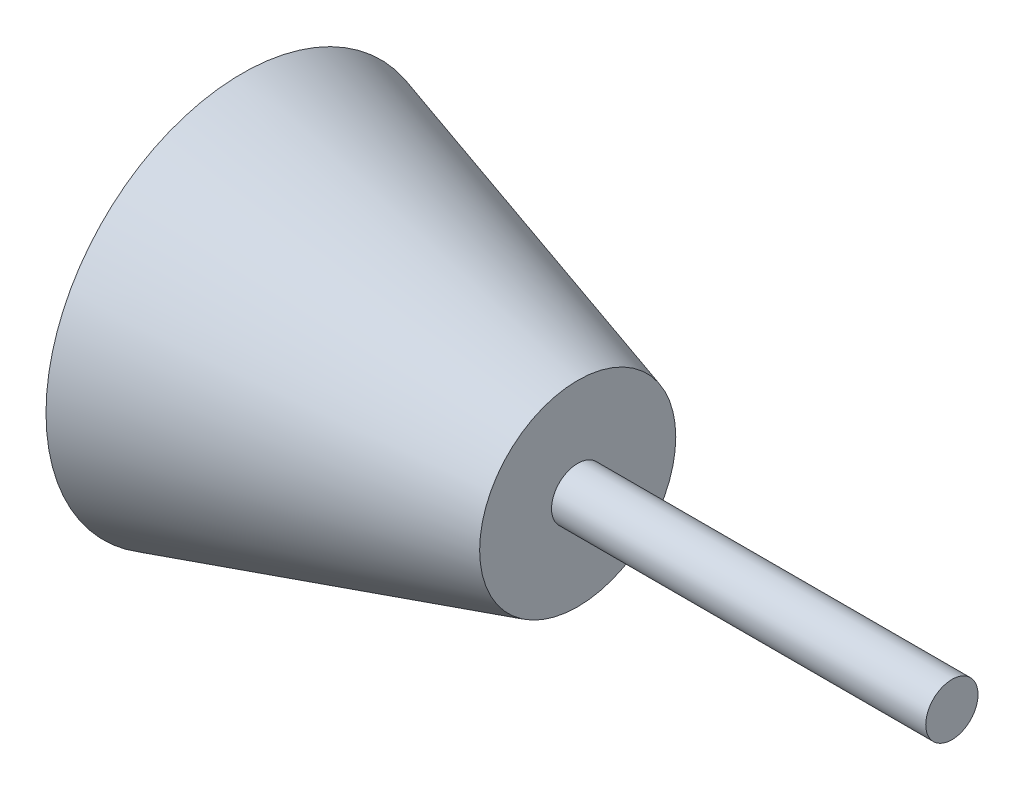
ISO-10303-21;
HEADER;
FILE_DESCRIPTION(('STEP AP214'),'2;1');
FILE_NAME('part.step','',(''),(''),'','','');
FILE_SCHEMA(('AUTOMOTIVE_DESIGN { 1 0 10303 214 1 1 1 1 }'));
ENDSEC;
DATA;
#1=APPLICATION_CONTEXT('core data for automotive mechanical design processes');
#2=APPLICATION_PROTOCOL_DEFINITION('international standard','automotive_design',2000,#1);
#3=PRODUCT_CONTEXT('',#1,'mechanical');
#4=PRODUCT('Part','Part','',(#3));
#5=PRODUCT_RELATED_PRODUCT_CATEGORY('part','',(#4));
#6=PRODUCT_DEFINITION_FORMATION('','',#4);
#7=PRODUCT_DEFINITION_CONTEXT('part definition',#1,'design');
#8=PRODUCT_DEFINITION('design','',#6,#7);
#9=PRODUCT_DEFINITION_SHAPE('','',#8);
#10=(LENGTH_UNIT() NAMED_UNIT(*) SI_UNIT(.MILLI.,.METRE.));
#11=(NAMED_UNIT(*) PLANE_ANGLE_UNIT() SI_UNIT($,.RADIAN.));
#12=(NAMED_UNIT(*) SI_UNIT($,.STERADIAN.) SOLID_ANGLE_UNIT());
#13=UNCERTAINTY_MEASURE_WITH_UNIT(LENGTH_MEASURE(1.E-05),#10,'distance_accuracy_value','');
#14=(GEOMETRIC_REPRESENTATION_CONTEXT(3) GLOBAL_UNCERTAINTY_ASSIGNED_CONTEXT((#13)) GLOBAL_UNIT_ASSIGNED_CONTEXT((#10,
#11,#12)) REPRESENTATION_CONTEXT('',''));
#15=CARTESIAN_POINT('',(0.,0.,0.));
#16=DIRECTION('',(0.,0.,1.));
#17=DIRECTION('',(1.,0.,0.));
#18=AXIS2_PLACEMENT_3D('',#15,#16,#17);
#19=CARTESIAN_POINT('',(525.,890.,0.));
#20=DIRECTION('',(-1.,0.,0.));
#21=DIRECTION('',(0.,0.,1.));
#22=AXIS2_PLACEMENT_3D('',#19,#20,#21);
#23=PLANE('',#22);
#24=CARTESIAN_POINT('',(525.,890.,0.));
#25=DIRECTION('',(-1.,0.,0.));
#26=DIRECTION('',(0.,0.,1.));
#27=AXIS2_PLACEMENT_3D('',#24,#25,#26);
#28=CIRCLE('',#27,15.);
#29=CARTESIAN_POINT('',(525.,890.,15.));
#30=VERTEX_POINT('',#29);
#31=EDGE_CURVE('E10',#30,#30,#28,.T.);
#32=ORIENTED_EDGE('',*,*,#31,.T.);
#33=EDGE_LOOP('',(#32));
#34=FACE_BOUND('',#33,.T.);
#35=ADVANCED_FACE('F34',(#34),#23,.T.);
#36=CARTESIAN_POINT('',(525.,890.,0.));
#37=DIRECTION('',(-1.,0.,0.));
#38=DIRECTION('',(0.,0.,1.));
#39=AXIS2_PLACEMENT_3D('',#36,#37,#38);
#40=CONICAL_SURFACE('',#39,15.,0.284334503030058);
#41=CARTESIAN_POINT('',(550.662685475554,890.,0.));
#42=DIRECTION('',(-1.,0.,0.));
#43=DIRECTION('',(0.,0.,1.));
#44=AXIS2_PLACEMENT_3D('',#41,#42,#43);
#45=CIRCLE('',#44,7.49999999999995);
#46=CARTESIAN_POINT('',(550.662685475554,890.,7.49999999999995));
#47=VERTEX_POINT('',#46);
#48=EDGE_CURVE('E41',#47,#47,#45,.T.);
#49=ORIENTED_EDGE('',*,*,#48,.T.);
#50=EDGE_LOOP('',(#49));
#51=FACE_BOUND('',#50,.T.);
#52=ORIENTED_EDGE('',*,*,#31,.F.);
#53=EDGE_LOOP('',(#52));
#54=FACE_BOUND('',#53,.T.);
#55=ADVANCED_FACE('F70',(#51,#54),#40,.T.);
#56=CARTESIAN_POINT('',(550.662685475554,882.5,0.));
#57=DIRECTION('',(1.,0.,0.));
#58=DIRECTION('',(0.,0.,-1.));
#59=AXIS2_PLACEMENT_3D('',#56,#57,#58);
#60=PLANE('',#59);
#61=CARTESIAN_POINT('',(550.662685475554,890.,0.));
#62=DIRECTION('',(-1.,0.,0.));
#63=DIRECTION('',(0.,0.,1.));
#64=AXIS2_PLACEMENT_3D('',#61,#62,#63);
#65=CIRCLE('',#64,2.);
#66=CARTESIAN_POINT('',(550.662685475554,890.,2.));
#67=VERTEX_POINT('',#66);
#68=EDGE_CURVE('E46',#67,#67,#65,.T.);
#69=ORIENTED_EDGE('',*,*,#68,.T.);
#70=EDGE_LOOP('',(#69));
#71=FACE_BOUND('',#70,.T.);
#72=ORIENTED_EDGE('',*,*,#48,.F.);
#73=EDGE_LOOP('',(#72));
#74=FACE_BOUND('',#73,.T.);
#75=ADVANCED_FACE('F67',(#71,#74),#60,.T.);
#76=CARTESIAN_POINT('',(525.,890.,0.));
#77=DIRECTION('',(-1.,0.,0.));
#78=DIRECTION('',(0.,0.,1.));
#79=AXIS2_PLACEMENT_3D('',#76,#77,#78);
#80=CYLINDRICAL_SURFACE('',#79,2.);
#81=CARTESIAN_POINT('',(579.279710513016,890.,0.));
#82=DIRECTION('',(-1.,0.,0.));
#83=DIRECTION('',(0.,0.,1.));
#84=AXIS2_PLACEMENT_3D('',#81,#82,#83);
#85=CIRCLE('',#84,2.);
#86=CARTESIAN_POINT('',(579.279710513016,890.,2.));
#87=VERTEX_POINT('',#86);
#88=EDGE_CURVE('E51',#87,#87,#85,.T.);
#89=ORIENTED_EDGE('',*,*,#88,.T.);
#90=EDGE_LOOP('',(#89));
#91=FACE_BOUND('',#90,.T.);
#92=ORIENTED_EDGE('',*,*,#68,.F.);
#93=EDGE_LOOP('',(#92));
#94=FACE_BOUND('',#93,.T.);
#95=ADVANCED_FACE('F58',(#91,#94),#80,.T.);
#96=CARTESIAN_POINT('',(579.279710513016,888.,0.));
#97=DIRECTION('',(1.,0.,0.));
#98=DIRECTION('',(0.,0.,-1.));
#99=AXIS2_PLACEMENT_3D('',#96,#97,#98);
#100=PLANE('',#99);
#101=ORIENTED_EDGE('',*,*,#88,.F.);
#102=EDGE_LOOP('',(#101));
#103=FACE_BOUND('',#102,.T.);
#104=ADVANCED_FACE('F61',(#103),#100,.T.);
#105=CLOSED_SHELL('',(#35,#55,#75,#95,#104));
#106=MANIFOLD_SOLID_BREP('B2',#105);
#107=ADVANCED_BREP_SHAPE_REPRESENTATION('',(#18,#106),#14);
#108=SHAPE_DEFINITION_REPRESENTATION(#9,#107);
ENDSEC;
END-ISO-10303-21;
